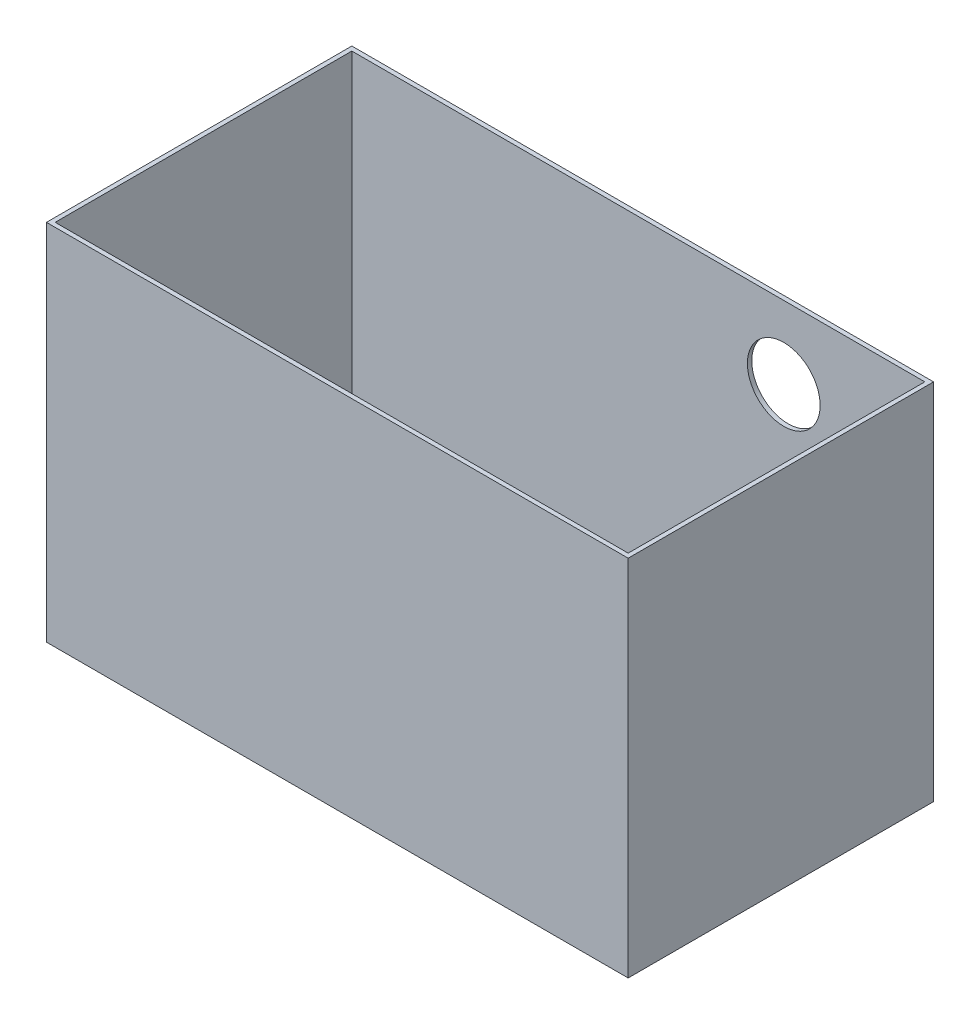
ISO-10303-21;
HEADER;
FILE_DESCRIPTION(('STEP AP214'),'2;1');
FILE_NAME('part.step','',(''),(''),'','','');
FILE_SCHEMA(('AUTOMOTIVE_DESIGN { 1 0 10303 214 1 1 1 1 }'));
ENDSEC;
DATA;
#1=APPLICATION_CONTEXT('core data for automotive mechanical design processes');
#2=APPLICATION_PROTOCOL_DEFINITION('international standard','automotive_design',2000,#1);
#3=PRODUCT_CONTEXT('',#1,'mechanical');
#4=PRODUCT('Part','Part','',(#3));
#5=PRODUCT_RELATED_PRODUCT_CATEGORY('part','',(#4));
#6=PRODUCT_DEFINITION_FORMATION('','',#4);
#7=PRODUCT_DEFINITION_CONTEXT('part definition',#1,'design');
#8=PRODUCT_DEFINITION('design','',#6,#7);
#9=PRODUCT_DEFINITION_SHAPE('','',#8);
#10=(LENGTH_UNIT() NAMED_UNIT(*) SI_UNIT(.MILLI.,.METRE.));
#11=(NAMED_UNIT(*) PLANE_ANGLE_UNIT() SI_UNIT($,.RADIAN.));
#12=(NAMED_UNIT(*) SI_UNIT($,.STERADIAN.) SOLID_ANGLE_UNIT());
#13=UNCERTAINTY_MEASURE_WITH_UNIT(LENGTH_MEASURE(1.E-05),#10,'distance_accuracy_value','');
#14=(GEOMETRIC_REPRESENTATION_CONTEXT(3) GLOBAL_UNCERTAINTY_ASSIGNED_CONTEXT((#13)) GLOBAL_UNIT_ASSIGNED_CONTEXT((#10,
#11,#12)) REPRESENTATION_CONTEXT('',''));
#15=CARTESIAN_POINT('',(0.,0.,0.));
#16=DIRECTION('',(0.,0.,1.));
#17=DIRECTION('',(1.,0.,0.));
#18=AXIS2_PLACEMENT_3D('',#15,#16,#17);
#19=CARTESIAN_POINT('',(0.,250.,0.));
#20=DIRECTION('',(0.,1.,0.));
#21=DIRECTION('',(0.,0.,1.));
#22=AXIS2_PLACEMENT_3D('',#19,#20,#21);
#23=PLANE('',#22);
#24=DIRECTION('',(0.,0.,1.));
#25=VECTOR('',#24,1.);
#26=CARTESIAN_POINT('',(0.,250.,0.));
#27=LINE('',#26,#25);
#28=CARTESIAN_POINT('',(0.,250.,0.));
#29=VERTEX_POINT('',#28);
#30=CARTESIAN_POINT('',(0.,250.,210.));
#31=VERTEX_POINT('',#30);
#32=EDGE_CURVE('E160',#29,#31,#27,.T.);
#33=ORIENTED_EDGE('',*,*,#32,.T.);
#34=DIRECTION('',(1.,0.,0.));
#35=VECTOR('',#34,1.);
#36=CARTESIAN_POINT('',(0.,250.,210.));
#37=LINE('',#36,#35);
#38=CARTESIAN_POINT('',(400.,250.,210.));
#39=VERTEX_POINT('',#38);
#40=EDGE_CURVE('E163',#31,#39,#37,.T.);
#41=ORIENTED_EDGE('',*,*,#40,.T.);
#42=DIRECTION('',(0.,0.,-1.));
#43=VECTOR('',#42,1.);
#44=CARTESIAN_POINT('',(400.,250.,0.));
#45=LINE('',#44,#43);
#46=CARTESIAN_POINT('',(400.,250.,0.));
#47=VERTEX_POINT('',#46);
#48=EDGE_CURVE('E166',#39,#47,#45,.T.);
#49=ORIENTED_EDGE('',*,*,#48,.T.);
#50=DIRECTION('',(-1.,0.,0.));
#51=VECTOR('',#50,1.);
#52=CARTESIAN_POINT('',(0.,250.,0.));
#53=LINE('',#52,#51);
#54=EDGE_CURVE('E168',#47,#29,#53,.T.);
#55=ORIENTED_EDGE('',*,*,#54,.T.);
#56=EDGE_LOOP('',(#33,#41,#49,#55));
#57=FACE_BOUND('',#56,.T.);
#58=DIRECTION('',(1.,0.,0.));
#59=VECTOR('',#58,1.);
#60=CARTESIAN_POINT('',(0.,250.,207.));
#61=LINE('',#60,#59);
#62=CARTESIAN_POINT('',(3.00000000000003,250.,207.));
#63=VERTEX_POINT('',#62);
#64=CARTESIAN_POINT('',(397.,250.,207.));
#65=VERTEX_POINT('',#64);
#66=EDGE_CURVE('E131',#63,#65,#61,.T.);
#67=ORIENTED_EDGE('',*,*,#66,.F.);
#68=DIRECTION('',(0.,0.,1.));
#69=VECTOR('',#68,1.);
#70=CARTESIAN_POINT('',(3.,250.,0.));
#71=LINE('',#70,#69);
#72=CARTESIAN_POINT('',(3.,250.,3.));
#73=VERTEX_POINT('',#72);
#74=EDGE_CURVE('E123',#73,#63,#71,.T.);
#75=ORIENTED_EDGE('',*,*,#74,.F.);
#76=DIRECTION('',(-1.,0.,0.));
#77=VECTOR('',#76,1.);
#78=CARTESIAN_POINT('',(0.,250.,3.));
#79=LINE('',#78,#77);
#80=CARTESIAN_POINT('',(397.,250.,3.));
#81=VERTEX_POINT('',#80);
#82=EDGE_CURVE('E145',#81,#73,#79,.T.);
#83=ORIENTED_EDGE('',*,*,#82,.F.);
#84=DIRECTION('',(0.,0.,-1.));
#85=VECTOR('',#84,1.);
#86=CARTESIAN_POINT('',(397.,250.,0.));
#87=LINE('',#86,#85);
#88=EDGE_CURVE('E143',#65,#81,#87,.T.);
#89=ORIENTED_EDGE('',*,*,#88,.F.);
#90=EDGE_LOOP('',(#67,#75,#83,#89));
#91=FACE_BOUND('',#90,.T.);
#92=ADVANCED_FACE('F57',(#57,#91),#23,.T.);
#93=CARTESIAN_POINT('',(0.,0.,0.));
#94=DIRECTION('',(0.,1.,0.));
#95=DIRECTION('',(0.,0.,1.));
#96=AXIS2_PLACEMENT_3D('',#93,#94,#95);
#97=PLANE('',#96);
#98=DIRECTION('',(0.,0.,1.));
#99=VECTOR('',#98,1.);
#100=CARTESIAN_POINT('',(0.,0.,0.));
#101=LINE('',#100,#99);
#102=CARTESIAN_POINT('',(0.,0.,0.));
#103=VERTEX_POINT('',#102);
#104=CARTESIAN_POINT('',(0.,0.,210.));
#105=VERTEX_POINT('',#104);
#106=EDGE_CURVE('E139',#103,#105,#101,.T.);
#107=ORIENTED_EDGE('',*,*,#106,.F.);
#108=DIRECTION('',(-1.,0.,0.));
#109=VECTOR('',#108,1.);
#110=CARTESIAN_POINT('',(0.,0.,0.));
#111=LINE('',#110,#109);
#112=CARTESIAN_POINT('',(400.,0.,0.));
#113=VERTEX_POINT('',#112);
#114=EDGE_CURVE('E164',#113,#103,#111,.T.);
#115=ORIENTED_EDGE('',*,*,#114,.F.);
#116=DIRECTION('',(0.,0.,-1.));
#117=VECTOR('',#116,1.);
#118=CARTESIAN_POINT('',(400.,0.,0.));
#119=LINE('',#118,#117);
#120=CARTESIAN_POINT('',(400.,0.,210.));
#121=VERTEX_POINT('',#120);
#122=EDGE_CURVE('E175',#121,#113,#119,.T.);
#123=ORIENTED_EDGE('',*,*,#122,.F.);
#124=DIRECTION('',(1.,0.,0.));
#125=VECTOR('',#124,1.);
#126=CARTESIAN_POINT('',(0.,0.,210.));
#127=LINE('',#126,#125);
#128=EDGE_CURVE('E173',#105,#121,#127,.T.);
#129=ORIENTED_EDGE('',*,*,#128,.F.);
#130=EDGE_LOOP('',(#107,#115,#123,#129));
#131=FACE_BOUND('',#130,.T.);
#132=DIRECTION('',(0.,0.,1.));
#133=VECTOR('',#132,1.);
#134=CARTESIAN_POINT('',(3.,0.,0.));
#135=LINE('',#134,#133);
#136=CARTESIAN_POINT('',(3.,0.,3.));
#137=VERTEX_POINT('',#136);
#138=CARTESIAN_POINT('',(3.00000000000003,0.,207.));
#139=VERTEX_POINT('',#138);
#140=EDGE_CURVE('E81',#137,#139,#135,.T.);
#141=ORIENTED_EDGE('',*,*,#140,.T.);
#142=DIRECTION('',(1.,0.,0.));
#143=VECTOR('',#142,1.);
#144=CARTESIAN_POINT('',(0.,0.,207.));
#145=LINE('',#144,#143);
#146=CARTESIAN_POINT('',(397.,0.,207.));
#147=VERTEX_POINT('',#146);
#148=EDGE_CURVE('E138',#139,#147,#145,.T.);
#149=ORIENTED_EDGE('',*,*,#148,.T.);
#150=DIRECTION('',(0.,0.,-1.));
#151=VECTOR('',#150,1.);
#152=CARTESIAN_POINT('',(397.,0.,0.));
#153=LINE('',#152,#151);
#154=CARTESIAN_POINT('',(397.,0.,3.));
#155=VERTEX_POINT('',#154);
#156=EDGE_CURVE('E152',#147,#155,#153,.T.);
#157=ORIENTED_EDGE('',*,*,#156,.T.);
#158=DIRECTION('',(-1.,0.,0.));
#159=VECTOR('',#158,1.);
#160=CARTESIAN_POINT('',(0.,0.,3.));
#161=LINE('',#160,#159);
#162=EDGE_CURVE('E132',#155,#137,#161,.T.);
#163=ORIENTED_EDGE('',*,*,#162,.T.);
#164=EDGE_LOOP('',(#141,#149,#157,#163));
#165=FACE_BOUND('',#164,.T.);
#166=ADVANCED_FACE('F194',(#131,#165),#97,.F.);
#167=CARTESIAN_POINT('',(0.,250.,0.));
#168=DIRECTION('',(1.,0.,0.));
#169=DIRECTION('',(0.,0.,-1.));
#170=AXIS2_PLACEMENT_3D('',#167,#168,#169);
#171=PLANE('',#170);
#172=ORIENTED_EDGE('',*,*,#106,.T.);
#173=DIRECTION('',(0.,-1.,0.));
#174=VECTOR('',#173,1.);
#175=CARTESIAN_POINT('',(0.,250.,210.));
#176=LINE('',#175,#174);
#177=EDGE_CURVE('E12',#31,#105,#176,.T.);
#178=ORIENTED_EDGE('',*,*,#177,.F.);
#179=ORIENTED_EDGE('',*,*,#32,.F.);
#180=DIRECTION('',(0.,-1.,0.));
#181=VECTOR('',#180,1.);
#182=CARTESIAN_POINT('',(0.,250.,0.));
#183=LINE('',#182,#181);
#184=EDGE_CURVE('E170',#29,#103,#183,.T.);
#185=ORIENTED_EDGE('',*,*,#184,.T.);
#186=EDGE_LOOP('',(#172,#178,#179,#185));
#187=FACE_BOUND('',#186,.T.);
#188=ADVANCED_FACE('F59',(#187),#171,.F.);
#189=CARTESIAN_POINT('',(0.,250.,210.));
#190=DIRECTION('',(0.,0.,-1.));
#191=DIRECTION('',(-1.,0.,0.));
#192=AXIS2_PLACEMENT_3D('',#189,#190,#191);
#193=PLANE('',#192);
#194=ORIENTED_EDGE('',*,*,#128,.T.);
#195=DIRECTION('',(0.,-1.,0.));
#196=VECTOR('',#195,1.);
#197=CARTESIAN_POINT('',(400.,250.,210.));
#198=LINE('',#197,#196);
#199=EDGE_CURVE('E66',#39,#121,#198,.T.);
#200=ORIENTED_EDGE('',*,*,#199,.F.);
#201=ORIENTED_EDGE('',*,*,#40,.F.);
#202=ORIENTED_EDGE('',*,*,#177,.T.);
#203=EDGE_LOOP('',(#194,#200,#201,#202));
#204=FACE_BOUND('',#203,.T.);
#205=ADVANCED_FACE('F204',(#204),#193,.F.);
#206=CARTESIAN_POINT('',(400.,250.,0.));
#207=DIRECTION('',(-1.,0.,0.));
#208=DIRECTION('',(0.,0.,1.));
#209=AXIS2_PLACEMENT_3D('',#206,#207,#208);
#210=PLANE('',#209);
#211=ORIENTED_EDGE('',*,*,#122,.T.);
#212=DIRECTION('',(0.,-1.,0.));
#213=VECTOR('',#212,1.);
#214=CARTESIAN_POINT('',(400.,250.,0.));
#215=LINE('',#214,#213);
#216=EDGE_CURVE('E180',#47,#113,#215,.T.);
#217=ORIENTED_EDGE('',*,*,#216,.F.);
#218=ORIENTED_EDGE('',*,*,#48,.F.);
#219=ORIENTED_EDGE('',*,*,#199,.T.);
#220=EDGE_LOOP('',(#211,#217,#218,#219));
#221=FACE_BOUND('',#220,.T.);
#222=ADVANCED_FACE('F188',(#221),#210,.F.);
#223=CARTESIAN_POINT('',(0.,250.,0.));
#224=DIRECTION('',(0.,0.,1.));
#225=DIRECTION('',(1.,0.,0.));
#226=AXIS2_PLACEMENT_3D('',#223,#224,#225);
#227=PLANE('',#226);
#228=CARTESIAN_POINT('',(300.,200.,0.));
#229=DIRECTION('',(0.,0.,-1.));
#230=DIRECTION('',(-1.,0.,0.));
#231=AXIS2_PLACEMENT_3D('',#228,#229,#230);
#232=CIRCLE('',#231,25.);
#233=CARTESIAN_POINT('',(275.,200.,0.));
#234=VERTEX_POINT('',#233);
#235=EDGE_CURVE('E227',#234,#234,#232,.T.);
#236=ORIENTED_EDGE('',*,*,#235,.F.);
#237=EDGE_LOOP('',(#236));
#238=FACE_BOUND('',#237,.T.);
#239=ORIENTED_EDGE('',*,*,#114,.T.);
#240=ORIENTED_EDGE('',*,*,#184,.F.);
#241=ORIENTED_EDGE('',*,*,#54,.F.);
#242=ORIENTED_EDGE('',*,*,#216,.T.);
#243=EDGE_LOOP('',(#239,#240,#241,#242));
#244=FACE_BOUND('',#243,.T.);
#245=ADVANCED_FACE('F198',(#238,#244),#227,.F.);
#246=CARTESIAN_POINT('',(3.,250.,0.));
#247=DIRECTION('',(1.,0.,0.));
#248=DIRECTION('',(0.,0.,-1.));
#249=AXIS2_PLACEMENT_3D('',#246,#247,#248);
#250=PLANE('',#249);
#251=ORIENTED_EDGE('',*,*,#140,.F.);
#252=DIRECTION('',(0.,-1.,0.));
#253=VECTOR('',#252,1.);
#254=CARTESIAN_POINT('',(3.,250.,3.));
#255=LINE('',#254,#253);
#256=EDGE_CURVE('E127',#73,#137,#255,.T.);
#257=ORIENTED_EDGE('',*,*,#256,.F.);
#258=ORIENTED_EDGE('',*,*,#74,.T.);
#259=DIRECTION('',(0.,-1.,0.));
#260=VECTOR('',#259,1.);
#261=CARTESIAN_POINT('',(3.00000000000003,250.,207.));
#262=LINE('',#261,#260);
#263=EDGE_CURVE('E126',#63,#139,#262,.T.);
#264=ORIENTED_EDGE('',*,*,#263,.T.);
#265=EDGE_LOOP('',(#251,#257,#258,#264));
#266=FACE_BOUND('',#265,.T.);
#267=ADVANCED_FACE('F125',(#266),#250,.T.);
#268=CARTESIAN_POINT('',(0.,250.,207.));
#269=DIRECTION('',(0.,0.,-1.));
#270=DIRECTION('',(-1.,0.,0.));
#271=AXIS2_PLACEMENT_3D('',#268,#269,#270);
#272=PLANE('',#271);
#273=ORIENTED_EDGE('',*,*,#148,.F.);
#274=ORIENTED_EDGE('',*,*,#263,.F.);
#275=ORIENTED_EDGE('',*,*,#66,.T.);
#276=DIRECTION('',(0.,-1.,0.));
#277=VECTOR('',#276,1.);
#278=CARTESIAN_POINT('',(397.,250.,207.));
#279=LINE('',#278,#277);
#280=EDGE_CURVE('E140',#65,#147,#279,.T.);
#281=ORIENTED_EDGE('',*,*,#280,.T.);
#282=EDGE_LOOP('',(#273,#274,#275,#281));
#283=FACE_BOUND('',#282,.T.);
#284=ADVANCED_FACE('F135',(#283),#272,.T.);
#285=CARTESIAN_POINT('',(397.,250.,0.));
#286=DIRECTION('',(-1.,0.,0.));
#287=DIRECTION('',(0.,0.,1.));
#288=AXIS2_PLACEMENT_3D('',#285,#286,#287);
#289=PLANE('',#288);
#290=ORIENTED_EDGE('',*,*,#156,.F.);
#291=ORIENTED_EDGE('',*,*,#280,.F.);
#292=ORIENTED_EDGE('',*,*,#88,.T.);
#293=DIRECTION('',(0.,-1.,0.));
#294=VECTOR('',#293,1.);
#295=CARTESIAN_POINT('',(397.,250.,3.));
#296=LINE('',#295,#294);
#297=EDGE_CURVE('E73',#81,#155,#296,.T.);
#298=ORIENTED_EDGE('',*,*,#297,.T.);
#299=EDGE_LOOP('',(#290,#291,#292,#298));
#300=FACE_BOUND('',#299,.T.);
#301=ADVANCED_FACE('F236',(#300),#289,.T.);
#302=CARTESIAN_POINT('',(0.,250.,3.));
#303=DIRECTION('',(0.,0.,1.));
#304=DIRECTION('',(1.,0.,0.));
#305=AXIS2_PLACEMENT_3D('',#302,#303,#304);
#306=PLANE('',#305);
#307=CARTESIAN_POINT('',(300.,200.,3.));
#308=DIRECTION('',(0.,0.,1.));
#309=DIRECTION('',(1.,0.,0.));
#310=AXIS2_PLACEMENT_3D('',#307,#308,#309);
#311=CIRCLE('',#310,25.);
#312=CARTESIAN_POINT('',(325.,200.,3.));
#313=VERTEX_POINT('',#312);
#314=EDGE_CURVE('E61',#313,#313,#311,.T.);
#315=ORIENTED_EDGE('',*,*,#314,.F.);
#316=EDGE_LOOP('',(#315));
#317=FACE_BOUND('',#316,.T.);
#318=ORIENTED_EDGE('',*,*,#162,.F.);
#319=ORIENTED_EDGE('',*,*,#297,.F.);
#320=ORIENTED_EDGE('',*,*,#82,.T.);
#321=ORIENTED_EDGE('',*,*,#256,.T.);
#322=EDGE_LOOP('',(#318,#319,#320,#321));
#323=FACE_BOUND('',#322,.T.);
#324=ADVANCED_FACE('F234',(#317,#323),#306,.T.);
#325=CARTESIAN_POINT('',(300.,200.,10.));
#326=DIRECTION('',(0.,0.,-1.));
#327=DIRECTION('',(-1.,0.,0.));
#328=AXIS2_PLACEMENT_3D('',#325,#326,#327);
#329=CYLINDRICAL_SURFACE('',#328,25.);
#330=ORIENTED_EDGE('',*,*,#314,.T.);
#331=EDGE_LOOP('',(#330));
#332=FACE_BOUND('',#331,.T.);
#333=ORIENTED_EDGE('',*,*,#235,.T.);
#334=EDGE_LOOP('',(#333));
#335=FACE_BOUND('',#334,.T.);
#336=ADVANCED_FACE('F232',(#332,#335),#329,.F.);
#337=CLOSED_SHELL('',(#92,#166,#188,#205,#222,#245,#267,#284,#301,#324,#336));
#338=MANIFOLD_SOLID_BREP('B2',#337);
#339=ADVANCED_BREP_SHAPE_REPRESENTATION('',(#18,#338),#14);
#340=SHAPE_DEFINITION_REPRESENTATION(#9,#339);
ENDSEC;
END-ISO-10303-21;
